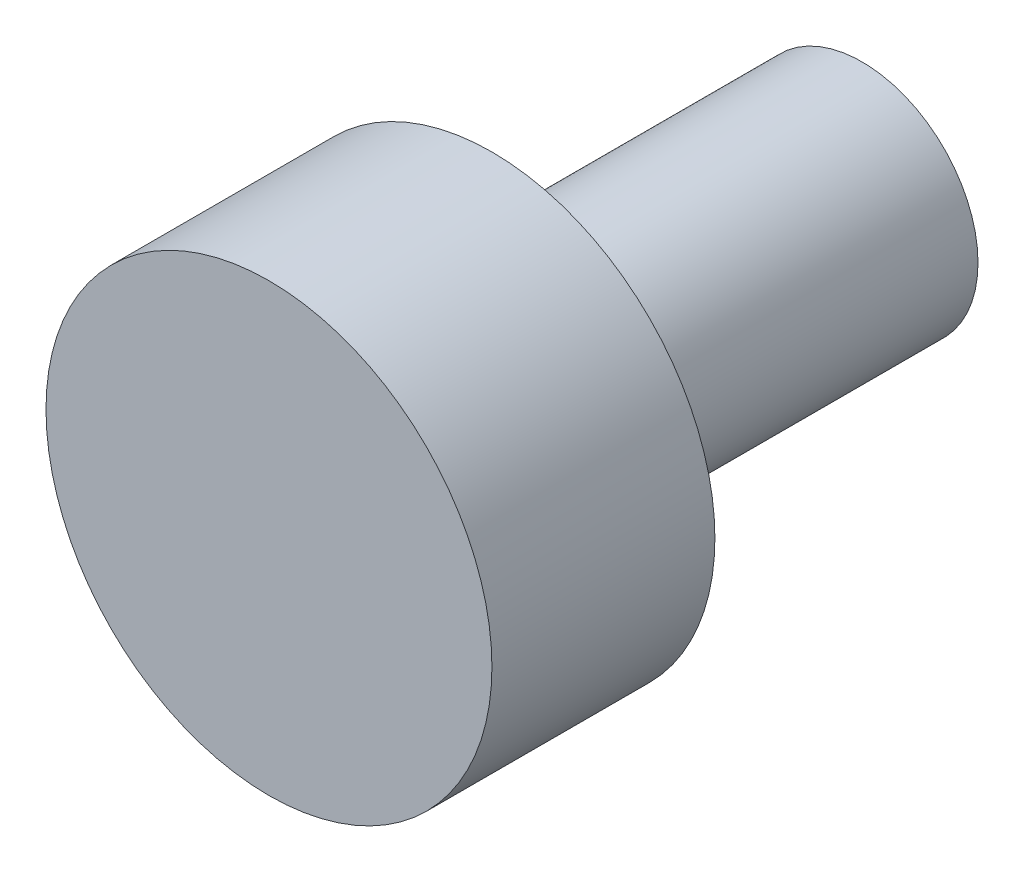
ISO-10303-21;
HEADER;
FILE_DESCRIPTION(('STEP AP214'),'2;1');
FILE_NAME('part.step','',(''),(''),'','','');
FILE_SCHEMA(('AUTOMOTIVE_DESIGN { 1 0 10303 214 1 1 1 1 }'));
ENDSEC;
DATA;
#1=APPLICATION_CONTEXT('core data for automotive mechanical design processes');
#2=APPLICATION_PROTOCOL_DEFINITION('international standard','automotive_design',2000,#1);
#3=PRODUCT_CONTEXT('',#1,'mechanical');
#4=PRODUCT('Part','Part','',(#3));
#5=PRODUCT_RELATED_PRODUCT_CATEGORY('part','',(#4));
#6=PRODUCT_DEFINITION_FORMATION('','',#4);
#7=PRODUCT_DEFINITION_CONTEXT('part definition',#1,'design');
#8=PRODUCT_DEFINITION('design','',#6,#7);
#9=PRODUCT_DEFINITION_SHAPE('','',#8);
#10=(LENGTH_UNIT() NAMED_UNIT(*) SI_UNIT(.MILLI.,.METRE.));
#11=(NAMED_UNIT(*) PLANE_ANGLE_UNIT() SI_UNIT($,.RADIAN.));
#12=(NAMED_UNIT(*) SI_UNIT($,.STERADIAN.) SOLID_ANGLE_UNIT());
#13=UNCERTAINTY_MEASURE_WITH_UNIT(LENGTH_MEASURE(1.E-05),#10,'distance_accuracy_value','');
#14=(GEOMETRIC_REPRESENTATION_CONTEXT(3) GLOBAL_UNCERTAINTY_ASSIGNED_CONTEXT((#13)) GLOBAL_UNIT_ASSIGNED_CONTEXT((#10,
#11,#12)) REPRESENTATION_CONTEXT('',''));
#15=CARTESIAN_POINT('',(0.,0.,0.));
#16=DIRECTION('',(0.,0.,1.));
#17=DIRECTION('',(1.,0.,0.));
#18=AXIS2_PLACEMENT_3D('',#15,#16,#17);
#19=CARTESIAN_POINT('',(0.,0.,5.));
#20=DIRECTION('',(0.,0.,-1.));
#21=DIRECTION('',(-1.,0.,0.));
#22=AXIS2_PLACEMENT_3D('',#19,#20,#21);
#23=CYLINDRICAL_SURFACE('',#22,5.);
#24=CARTESIAN_POINT('',(0.,0.,5.));
#25=DIRECTION('',(0.,0.,1.));
#26=DIRECTION('',(1.,0.,0.));
#27=AXIS2_PLACEMENT_3D('',#24,#25,#26);
#28=CIRCLE('',#27,5.);
#29=CARTESIAN_POINT('',(5.,0.,5.));
#30=VERTEX_POINT('',#29);
#31=EDGE_CURVE('E38',#30,#30,#28,.T.);
#32=ORIENTED_EDGE('',*,*,#31,.F.);
#33=EDGE_LOOP('',(#32));
#34=FACE_BOUND('',#33,.T.);
#35=CARTESIAN_POINT('',(0.,0.,0.));
#36=DIRECTION('',(0.,0.,1.));
#37=DIRECTION('',(1.,0.,0.));
#38=AXIS2_PLACEMENT_3D('',#35,#36,#37);
#39=CIRCLE('',#38,5.);
#40=CARTESIAN_POINT('',(5.,0.,0.));
#41=VERTEX_POINT('',#40);
#42=EDGE_CURVE('E34',#41,#41,#39,.T.);
#43=ORIENTED_EDGE('',*,*,#42,.T.);
#44=EDGE_LOOP('',(#43));
#45=FACE_BOUND('',#44,.T.);
#46=ADVANCED_FACE('F31',(#34,#45),#23,.T.);
#47=CARTESIAN_POINT('',(0.,0.,5.));
#48=DIRECTION('',(0.,0.,1.));
#49=DIRECTION('',(1.,0.,0.));
#50=AXIS2_PLACEMENT_3D('',#47,#48,#49);
#51=PLANE('',#50);
#52=ORIENTED_EDGE('',*,*,#31,.T.);
#53=EDGE_LOOP('',(#52));
#54=FACE_BOUND('',#53,.T.);
#55=ADVANCED_FACE('F75',(#54),#51,.T.);
#56=CARTESIAN_POINT('',(0.,0.,0.));
#57=DIRECTION('',(0.,0.,1.));
#58=DIRECTION('',(1.,0.,0.));
#59=AXIS2_PLACEMENT_3D('',#56,#57,#58);
#60=PLANE('',#59);
#61=CARTESIAN_POINT('',(0.,0.,0.));
#62=DIRECTION('',(0.,0.,-1.));
#63=DIRECTION('',(-1.,0.,0.));
#64=AXIS2_PLACEMENT_3D('',#61,#62,#63);
#65=CIRCLE('',#64,2.6);
#66=CARTESIAN_POINT('',(2.6,0.,0.));
#67=VERTEX_POINT('',#66);
#68=EDGE_CURVE('E10',#67,#67,#65,.T.);
#69=ORIENTED_EDGE('',*,*,#68,.F.);
#70=EDGE_LOOP('',(#69));
#71=FACE_BOUND('',#70,.T.);
#72=ORIENTED_EDGE('',*,*,#42,.F.);
#73=EDGE_LOOP('',(#72));
#74=FACE_BOUND('',#73,.T.);
#75=ADVANCED_FACE('F70',(#71,#74),#60,.F.);
#76=CARTESIAN_POINT('',(0.,0.,-8.3));
#77=DIRECTION('',(0.,0.,1.));
#78=DIRECTION('',(1.,0.,0.));
#79=AXIS2_PLACEMENT_3D('',#76,#77,#78);
#80=CYLINDRICAL_SURFACE('',#79,2.6);
#81=CARTESIAN_POINT('',(0.,0.,-8.3));
#82=DIRECTION('',(0.,0.,-1.));
#83=DIRECTION('',(-1.,0.,0.));
#84=AXIS2_PLACEMENT_3D('',#81,#82,#83);
#85=CIRCLE('',#84,2.6);
#86=CARTESIAN_POINT('',(2.6,0.,-8.3));
#87=VERTEX_POINT('',#86);
#88=EDGE_CURVE('E44',#87,#87,#85,.T.);
#89=CARTESIAN_POINT('',(2.6,0.,-8.3));
#90=CARTESIAN_POINT('',(2.6,0.,-8.21354166666667));
#91=CARTESIAN_POINT('',(2.6,0.,-8.12708333333333));
#92=CARTESIAN_POINT('',(2.6,0.,-7.95416666666667));
#93=CARTESIAN_POINT('',(2.6,0.,-7.86770833333333));
#94=CARTESIAN_POINT('',(2.6,0.,-7.69479166666667));
#95=CARTESIAN_POINT('',(2.6,0.,-7.60833333333333));
#96=CARTESIAN_POINT('',(2.6,0.,-7.43541666666667));
#97=CARTESIAN_POINT('',(2.6,0.,-7.34895833333333));
#98=CARTESIAN_POINT('',(2.6,0.,-7.17604166666667));
#99=CARTESIAN_POINT('',(2.6,0.,-7.08958333333333));
#100=CARTESIAN_POINT('',(2.6,0.,-6.91666666666667));
#101=CARTESIAN_POINT('',(2.6,0.,-6.83020833333333));
#102=CARTESIAN_POINT('',(2.6,0.,-6.65729166666667));
#103=CARTESIAN_POINT('',(2.6,0.,-6.57083333333333));
#104=CARTESIAN_POINT('',(2.6,0.,-6.39791666666667));
#105=CARTESIAN_POINT('',(2.6,0.,-6.31145833333333));
#106=CARTESIAN_POINT('',(2.6,0.,-6.13854166666667));
#107=CARTESIAN_POINT('',(2.6,0.,-6.05208333333333));
#108=CARTESIAN_POINT('',(2.6,0.,-5.87916666666667));
#109=CARTESIAN_POINT('',(2.6,0.,-5.79270833333333));
#110=CARTESIAN_POINT('',(2.6,0.,-5.61979166666667));
#111=CARTESIAN_POINT('',(2.6,0.,-5.53333333333333));
#112=CARTESIAN_POINT('',(2.6,0.,-5.36041666666667));
#113=CARTESIAN_POINT('',(2.6,0.,-5.27395833333333));
#114=CARTESIAN_POINT('',(2.6,0.,-5.10104166666667));
#115=CARTESIAN_POINT('',(2.6,0.,-5.01458333333333));
#116=CARTESIAN_POINT('',(2.6,0.,-4.84166666666667));
#117=CARTESIAN_POINT('',(2.6,0.,-4.75520833333333));
#118=CARTESIAN_POINT('',(2.6,0.,-4.58229166666667));
#119=CARTESIAN_POINT('',(2.6,0.,-4.49583333333333));
#120=CARTESIAN_POINT('',(2.6,0.,-4.32291666666667));
#121=CARTESIAN_POINT('',(2.6,0.,-4.23645833333333));
#122=CARTESIAN_POINT('',(2.6,0.,-4.06354166666667));
#123=CARTESIAN_POINT('',(2.6,0.,-3.97708333333333));
#124=CARTESIAN_POINT('',(2.6,0.,-3.80416666666667));
#125=CARTESIAN_POINT('',(2.6,0.,-3.71770833333333));
#126=CARTESIAN_POINT('',(2.6,0.,-3.54479166666667));
#127=CARTESIAN_POINT('',(2.6,0.,-3.45833333333333));
#128=CARTESIAN_POINT('',(2.6,0.,-3.28541666666667));
#129=CARTESIAN_POINT('',(2.6,0.,-3.19895833333333));
#130=CARTESIAN_POINT('',(2.6,0.,-3.02604166666667));
#131=CARTESIAN_POINT('',(2.6,0.,-2.93958333333333));
#132=CARTESIAN_POINT('',(2.6,0.,-2.76666666666667));
#133=CARTESIAN_POINT('',(2.6,0.,-2.68020833333333));
#134=CARTESIAN_POINT('',(2.6,0.,-2.50729166666667));
#135=CARTESIAN_POINT('',(2.6,0.,-2.42083333333333));
#136=CARTESIAN_POINT('',(2.6,0.,-2.24791666666667));
#137=CARTESIAN_POINT('',(2.6,0.,-2.16145833333333));
#138=CARTESIAN_POINT('',(2.6,0.,-1.98854166666667));
#139=CARTESIAN_POINT('',(2.6,0.,-1.90208333333333));
#140=CARTESIAN_POINT('',(2.6,0.,-1.72916666666667));
#141=CARTESIAN_POINT('',(2.6,0.,-1.64270833333333));
#142=CARTESIAN_POINT('',(2.6,0.,-1.46979166666667));
#143=CARTESIAN_POINT('',(2.6,0.,-1.38333333333333));
#144=CARTESIAN_POINT('',(2.6,0.,-1.21041666666667));
#145=CARTESIAN_POINT('',(2.6,0.,-1.12395833333333));
#146=CARTESIAN_POINT('',(2.6,0.,-0.951041666666667));
#147=CARTESIAN_POINT('',(2.6,0.,-0.864583333333333));
#148=CARTESIAN_POINT('',(2.6,0.,-0.691666666666667));
#149=CARTESIAN_POINT('',(2.6,0.,-0.605208333333333));
#150=CARTESIAN_POINT('',(2.6,0.,-0.432291666666666));
#151=CARTESIAN_POINT('',(2.6,0.,-0.345833333333333));
#152=CARTESIAN_POINT('',(2.6,0.,-0.172916666666666));
#153=CARTESIAN_POINT('',(2.6,0.,-0.086458333333333));
#154=CARTESIAN_POINT('',(2.6,0.,0.));
#155=B_SPLINE_CURVE_WITH_KNOTS('',3,(#89,#90,#91,#92,#93,#94,#95,#96,#97,#98,#99,#100,#101,#102,
#103,#104,#105,#106,#107,#108,#109,#110,#111,#112,#113,#114,#115,#116,#117,#118,#119,#120,#121,
#122,#123,#124,#125,#126,#127,#128,#129,#130,#131,#132,#133,#134,#135,#136,#137,#138,#139,#140,
#141,#142,#143,#144,#145,#146,#147,#148,#149,#150,#151,#152,#153,#154),.UNSPECIFIED.,.F.,.F.,(4,
2,2,2,2,2,2,2,2,2,2,2,2,2,2,2,2,2,2,2,2,2,2,2,2,2,2,2,2,2,2,2,4),(0.,0.259374999999999,
0.518749999999999,0.778124999999999,1.0375,1.296875,1.55625,1.815625,2.075,2.334375,2.59375,
2.853125,3.1125,3.371875,3.63125,3.890625,4.15,4.409375,4.66875,4.928125,5.1875,5.446875,
5.70625,5.965625,6.225,6.484375,6.74375,7.003125,7.2625,7.521875,7.78125,8.040625,8.3),.UNSPECIFIED.);
#156=EDGE_CURVE('BSEAM65',#87,#67,#155,.T.);
#157=ORIENTED_EDGE('',*,*,#88,.F.);
#158=ORIENTED_EDGE('',*,*,#68,.T.);
#159=ORIENTED_EDGE('',*,*,#156,.T.);
#160=ORIENTED_EDGE('',*,*,#156,.F.);
#161=EDGE_LOOP('',(#157,#159,#158,#160));
#162=FACE_BOUND('',#161,.T.);
#163=ADVANCED_FACE('F65',(#162),#80,.T.);
#164=CARTESIAN_POINT('',(0.,0.,-8.3));
#165=DIRECTION('',(0.,0.,-1.));
#166=DIRECTION('',(-1.,0.,0.));
#167=AXIS2_PLACEMENT_3D('',#164,#165,#166);
#168=PLANE('',#167);
#169=CARTESIAN_POINT('',(0.,0.,-8.3));
#170=DIRECTION('',(0.,0.,-1.));
#171=DIRECTION('',(-1.,0.,0.));
#172=AXIS2_PLACEMENT_3D('',#169,#170,#171);
#173=CIRCLE('',#172,0.9);
#174=CARTESIAN_POINT('',(-0.9,0.,-8.3));
#175=VERTEX_POINT('',#174);
#176=EDGE_CURVE('E48',#175,#175,#173,.T.);
#177=ORIENTED_EDGE('',*,*,#176,.F.);
#178=EDGE_LOOP('',(#177));
#179=FACE_BOUND('',#178,.T.);
#180=ORIENTED_EDGE('',*,*,#88,.T.);
#181=EDGE_LOOP('',(#180));
#182=FACE_BOUND('',#181,.T.);
#183=ADVANCED_FACE('F59',(#179,#182),#168,.T.);
#184=CARTESIAN_POINT('',(0.,0.,-0.8));
#185=DIRECTION('',(0.,0.,-1.));
#186=DIRECTION('',(-1.,0.,0.));
#187=AXIS2_PLACEMENT_3D('',#184,#185,#186);
#188=CYLINDRICAL_SURFACE('',#187,0.9);
#189=CARTESIAN_POINT('',(0.,0.,-0.8));
#190=DIRECTION('',(0.,0.,-1.));
#191=DIRECTION('',(-1.,0.,0.));
#192=AXIS2_PLACEMENT_3D('',#189,#190,#191);
#193=CIRCLE('',#192,0.9);
#194=CARTESIAN_POINT('',(-0.9,0.,-0.8));
#195=VERTEX_POINT('',#194);
#196=EDGE_CURVE('E47',#195,#195,#193,.T.);
#197=ORIENTED_EDGE('',*,*,#196,.F.);
#198=EDGE_LOOP('',(#197));
#199=FACE_BOUND('',#198,.T.);
#200=ORIENTED_EDGE('',*,*,#176,.T.);
#201=EDGE_LOOP('',(#200));
#202=FACE_BOUND('',#201,.T.);
#203=ADVANCED_FACE('F56',(#199,#202),#188,.F.);
#204=CARTESIAN_POINT('',(0.,0.,-0.8));
#205=DIRECTION('',(0.,0.,-1.));
#206=DIRECTION('',(-1.,0.,0.));
#207=AXIS2_PLACEMENT_3D('',#204,#205,#206);
#208=PLANE('',#207);
#209=ORIENTED_EDGE('',*,*,#196,.T.);
#210=EDGE_LOOP('',(#209));
#211=FACE_BOUND('',#210,.T.);
#212=ADVANCED_FACE('F54',(#211),#208,.T.);
#213=CLOSED_SHELL('',(#46,#55,#75,#163,#183,#203,#212));
#214=MANIFOLD_SOLID_BREP('B2',#213);
#215=ADVANCED_BREP_SHAPE_REPRESENTATION('',(#18,#214),#14);
#216=SHAPE_DEFINITION_REPRESENTATION(#9,#215);
ENDSEC;
END-ISO-10303-21;
